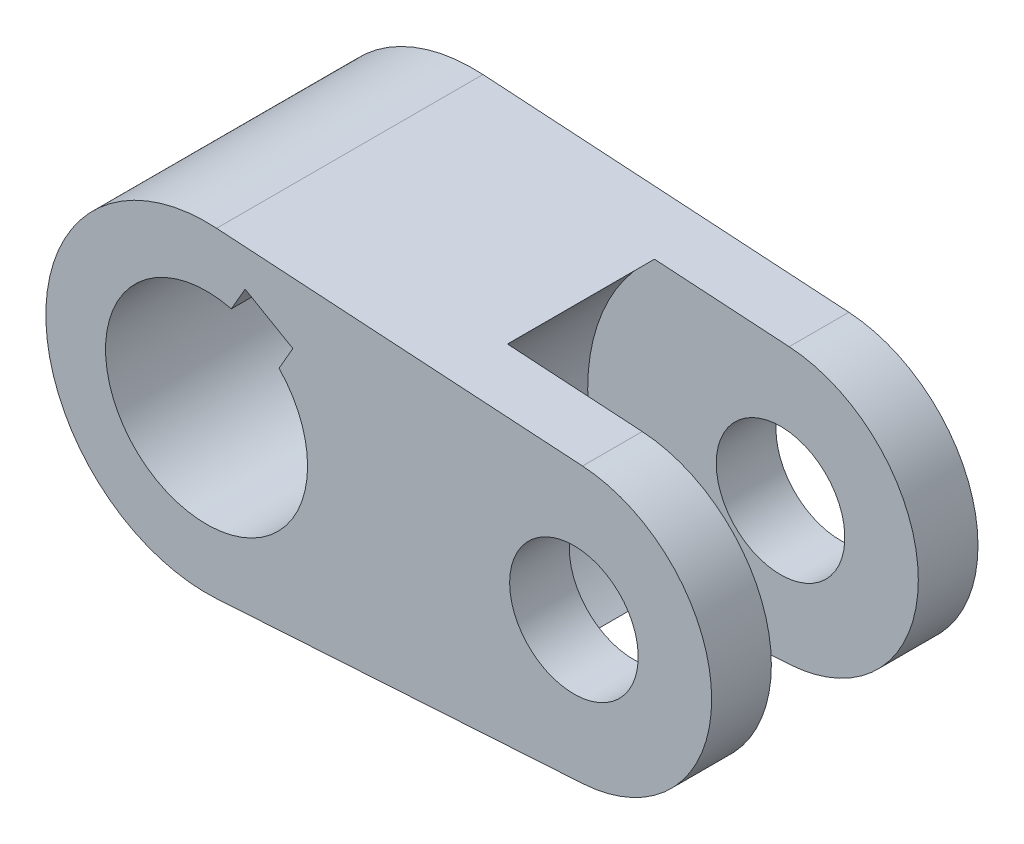
ISO-10303-21;
HEADER;
FILE_DESCRIPTION(('STEP AP214'),'2;1');
FILE_NAME('part.step','',(''),(''),'','','');
FILE_SCHEMA(('AUTOMOTIVE_DESIGN { 1 0 10303 214 1 1 1 1 }'));
ENDSEC;
DATA;
#1=APPLICATION_CONTEXT('core data for automotive mechanical design processes');
#2=APPLICATION_PROTOCOL_DEFINITION('international standard','automotive_design',2000,#1);
#3=PRODUCT_CONTEXT('',#1,'mechanical');
#4=PRODUCT('Part','Part','',(#3));
#5=PRODUCT_RELATED_PRODUCT_CATEGORY('part','',(#4));
#6=PRODUCT_DEFINITION_FORMATION('','',#4);
#7=PRODUCT_DEFINITION_CONTEXT('part definition',#1,'design');
#8=PRODUCT_DEFINITION('design','',#6,#7);
#9=PRODUCT_DEFINITION_SHAPE('','',#8);
#10=(LENGTH_UNIT() NAMED_UNIT(*) SI_UNIT(.MILLI.,.METRE.));
#11=(NAMED_UNIT(*) PLANE_ANGLE_UNIT() SI_UNIT($,.RADIAN.));
#12=(NAMED_UNIT(*) SI_UNIT($,.STERADIAN.) SOLID_ANGLE_UNIT());
#13=UNCERTAINTY_MEASURE_WITH_UNIT(LENGTH_MEASURE(1.E-05),#10,'distance_accuracy_value','');
#14=(GEOMETRIC_REPRESENTATION_CONTEXT(3) GLOBAL_UNCERTAINTY_ASSIGNED_CONTEXT((#13)) GLOBAL_UNIT_ASSIGNED_CONTEXT((#10,
#11,#12)) REPRESENTATION_CONTEXT('',''));
#15=CARTESIAN_POINT('',(0.,0.,0.));
#16=DIRECTION('',(0.,0.,1.));
#17=DIRECTION('',(1.,0.,0.));
#18=AXIS2_PLACEMENT_3D('',#15,#16,#17);
#19=CARTESIAN_POINT('',(40.,0.,14.5));
#20=DIRECTION('',(0.,0.,-1.));
#21=DIRECTION('',(-1.,0.,0.));
#22=AXIS2_PLACEMENT_3D('',#19,#20,#21);
#23=CYLINDRICAL_SURFACE('',#22,15.);
#24=CARTESIAN_POINT('',(40.,0.,-8.));
#25=DIRECTION('',(0.,0.,1.));
#26=DIRECTION('',(1.,0.,0.));
#27=AXIS2_PLACEMENT_3D('',#24,#25,#26);
#28=CIRCLE('',#27,15.);
#29=CARTESIAN_POINT('',(40.9375,-14.9706744587544,-8.));
#30=VERTEX_POINT('',#29);
#31=CARTESIAN_POINT('',(40.9375,14.9706744587544,-8.));
#32=VERTEX_POINT('',#31);
#33=EDGE_CURVE('E154',#30,#32,#28,.T.);
#34=ORIENTED_EDGE('',*,*,#33,.F.);
#35=DIRECTION('',(0.,0.,-1.));
#36=VECTOR('',#35,1.);
#37=CARTESIAN_POINT('',(40.9375,-14.9706744587544,14.5));
#38=LINE('',#37,#36);
#39=CARTESIAN_POINT('',(40.9375,-14.9706744587544,-14.5));
#40=VERTEX_POINT('',#39);
#41=EDGE_CURVE('E202',#30,#40,#38,.T.);
#42=ORIENTED_EDGE('',*,*,#41,.T.);
#43=CARTESIAN_POINT('',(40.,0.,-14.5));
#44=DIRECTION('',(0.,0.,1.));
#45=DIRECTION('',(1.,0.,0.));
#46=AXIS2_PLACEMENT_3D('',#43,#44,#45);
#47=CIRCLE('',#46,15.);
#48=CARTESIAN_POINT('',(40.9375,14.9706744587544,-14.5));
#49=VERTEX_POINT('',#48);
#50=EDGE_CURVE('E191',#40,#49,#47,.T.);
#51=ORIENTED_EDGE('',*,*,#50,.T.);
#52=DIRECTION('',(0.,0.,-1.));
#53=VECTOR('',#52,1.);
#54=CARTESIAN_POINT('',(40.9375,14.9706744587544,14.5));
#55=LINE('',#54,#53);
#56=EDGE_CURVE('E220',#32,#49,#55,.T.);
#57=ORIENTED_EDGE('',*,*,#56,.F.);
#58=EDGE_LOOP('',(#34,#42,#51,#57));
#59=FACE_BOUND('',#58,.T.);
#60=ADVANCED_FACE('F37',(#59),#23,.T.);
#61=CARTESIAN_POINT('',(40.9375,14.9706744587544,14.5));
#62=DIRECTION('',(-0.0625,-0.998044963916957,0.));
#63=DIRECTION('',(0.998044963916957,-0.0625,0.));
#64=AXIS2_PLACEMENT_3D('',#61,#62,#63);
#65=PLANE('',#64);
#66=DIRECTION('',(-0.998044963916957,0.0625,0.));
#67=VECTOR('',#66,1.);
#68=CARTESIAN_POINT('',(40.9375,14.9706744587544,-8.));
#69=LINE('',#68,#67);
#70=CARTESIAN_POINT('',(26.269294588294,15.889233112298,-8.));
#71=VERTEX_POINT('',#70);
#72=EDGE_CURVE('E137',#32,#71,#69,.T.);
#73=ORIENTED_EDGE('',*,*,#72,.F.);
#74=ORIENTED_EDGE('',*,*,#56,.T.);
#75=DIRECTION('',(-0.998044963916957,0.0625,0.));
#76=VECTOR('',#75,1.);
#77=CARTESIAN_POINT('',(40.9375,14.9706744587544,-14.5));
#78=LINE('',#77,#76);
#79=CARTESIAN_POINT('',(1.09375,17.4657868685467,-14.5));
#80=VERTEX_POINT('',#79);
#81=EDGE_CURVE('E205',#49,#80,#78,.T.);
#82=ORIENTED_EDGE('',*,*,#81,.T.);
#83=DIRECTION('',(0.,0.,-1.));
#84=VECTOR('',#83,1.);
#85=CARTESIAN_POINT('',(1.09375,17.4657868685467,14.5));
#86=LINE('',#85,#84);
#87=CARTESIAN_POINT('',(1.09375,17.4657868685467,14.5));
#88=VERTEX_POINT('',#87);
#89=EDGE_CURVE('E217',#88,#80,#86,.T.);
#90=ORIENTED_EDGE('',*,*,#89,.F.);
#91=DIRECTION('',(-0.998044963916957,0.0625,0.));
#92=VECTOR('',#91,1.);
#93=CARTESIAN_POINT('',(40.9375,14.9706744587544,14.5));
#94=LINE('',#93,#92);
#95=CARTESIAN_POINT('',(40.9375,14.9706744587544,14.5));
#96=VERTEX_POINT('',#95);
#97=EDGE_CURVE('E195',#96,#88,#94,.T.);
#98=ORIENTED_EDGE('',*,*,#97,.F.);
#99=CARTESIAN_POINT('',(40.9375,14.9706744587544,8.));
#100=VERTEX_POINT('',#99);
#101=EDGE_CURVE('E45',#96,#100,#55,.T.);
#102=ORIENTED_EDGE('',*,*,#101,.T.);
#103=DIRECTION('',(-0.998044963916957,0.0625,0.));
#104=VECTOR('',#103,1.);
#105=CARTESIAN_POINT('',(40.9375,14.9706744587544,8.));
#106=LINE('',#105,#104);
#107=CARTESIAN_POINT('',(26.269294588294,15.889233112298,8.));
#108=VERTEX_POINT('',#107);
#109=EDGE_CURVE('E140',#100,#108,#106,.T.);
#110=ORIENTED_EDGE('',*,*,#109,.T.);
#111=DIRECTION('',(0.,0.,1.));
#112=VECTOR('',#111,1.);
#113=CARTESIAN_POINT('',(26.2692945882941,15.889233112298,-8.));
#114=LINE('',#113,#112);
#115=EDGE_CURVE('E127',#108,#71,#114,.F.);
#116=ORIENTED_EDGE('',*,*,#115,.T.);
#117=EDGE_LOOP('',(#73,#74,#82,#90,#98,#102,#110,#116));
#118=FACE_BOUND('',#117,.T.);
#119=ADVANCED_FACE('F144',(#118),#65,.F.);
#120=CARTESIAN_POINT('',(40.9375,-14.9706744587544,14.5));
#121=DIRECTION('',(-0.0625000000000001,0.998044963916957,0.));
#122=DIRECTION('',(-0.998044963916957,-0.0625000000000001,0.));
#123=AXIS2_PLACEMENT_3D('',#120,#121,#122);
#124=PLANE('',#123);
#125=DIRECTION('',(0.998044963916957,0.0625000000000001,0.));
#126=VECTOR('',#125,1.);
#127=CARTESIAN_POINT('',(40.9375,-14.9706744587544,-8.));
#128=LINE('',#127,#126);
#129=CARTESIAN_POINT('',(26.2692945882941,-15.8892331122981,-8.));
#130=VERTEX_POINT('',#129);
#131=EDGE_CURVE('E149',#130,#30,#128,.T.);
#132=ORIENTED_EDGE('',*,*,#131,.F.);
#133=DIRECTION('',(0.,0.,1.));
#134=VECTOR('',#133,1.);
#135=CARTESIAN_POINT('',(26.2692945882941,-15.889233112298,-8.));
#136=LINE('',#135,#134);
#137=CARTESIAN_POINT('',(26.2692945882941,-15.8892331122981,8.));
#138=VERTEX_POINT('',#137);
#139=EDGE_CURVE('E11',#130,#138,#136,.T.);
#140=ORIENTED_EDGE('',*,*,#139,.T.);
#141=DIRECTION('',(0.998044963916957,0.0625000000000001,0.));
#142=VECTOR('',#141,1.);
#143=CARTESIAN_POINT('',(40.9375,-14.9706744587544,8.));
#144=LINE('',#143,#142);
#145=CARTESIAN_POINT('',(40.9375,-14.9706744587544,8.));
#146=VERTEX_POINT('',#145);
#147=EDGE_CURVE('E141',#138,#146,#144,.T.);
#148=ORIENTED_EDGE('',*,*,#147,.T.);
#149=CARTESIAN_POINT('',(40.9375,-14.9706744587544,14.5));
#150=VERTEX_POINT('',#149);
#151=EDGE_CURVE('E211',#150,#146,#38,.T.);
#152=ORIENTED_EDGE('',*,*,#151,.F.);
#153=DIRECTION('',(0.998044963916957,0.0625000000000001,0.));
#154=VECTOR('',#153,1.);
#155=CARTESIAN_POINT('',(40.9375,-14.9706744587544,14.5));
#156=LINE('',#155,#154);
#157=CARTESIAN_POINT('',(1.09374999999999,-17.4657868685468,14.5));
#158=VERTEX_POINT('',#157);
#159=EDGE_CURVE('E200',#158,#150,#156,.T.);
#160=ORIENTED_EDGE('',*,*,#159,.F.);
#161=DIRECTION('',(0.,0.,-1.));
#162=VECTOR('',#161,1.);
#163=CARTESIAN_POINT('',(1.09374999999999,-17.4657868685468,14.5));
#164=LINE('',#163,#162);
#165=CARTESIAN_POINT('',(1.09374999999999,-17.4657868685468,-14.5));
#166=VERTEX_POINT('',#165);
#167=EDGE_CURVE('E214',#158,#166,#164,.T.);
#168=ORIENTED_EDGE('',*,*,#167,.T.);
#169=DIRECTION('',(0.998044963916957,0.0625000000000001,0.));
#170=VECTOR('',#169,1.);
#171=CARTESIAN_POINT('',(40.9375,-14.9706744587544,-14.5));
#172=LINE('',#171,#170);
#173=EDGE_CURVE('E196',#166,#40,#172,.T.);
#174=ORIENTED_EDGE('',*,*,#173,.T.);
#175=ORIENTED_EDGE('',*,*,#41,.F.);
#176=EDGE_LOOP('',(#132,#140,#148,#152,#160,#168,#174,#175));
#177=FACE_BOUND('',#176,.T.);
#178=ADVANCED_FACE('F233',(#177),#124,.F.);
#179=CARTESIAN_POINT('',(40.,0.,14.5));
#180=DIRECTION('',(0.,0.,-1.));
#181=DIRECTION('',(-1.,0.,0.));
#182=AXIS2_PLACEMENT_3D('',#179,#180,#181);
#183=CYLINDRICAL_SURFACE('',#182,7.);
#184=CARTESIAN_POINT('',(40.,0.,-14.5));
#185=DIRECTION('',(0.,0.,1.));
#186=DIRECTION('',(1.,0.,0.));
#187=AXIS2_PLACEMENT_3D('',#184,#185,#186);
#188=CIRCLE('',#187,7.);
#189=CARTESIAN_POINT('',(33.,0.,-14.5));
#190=VERTEX_POINT('',#189);
#191=EDGE_CURVE('E136',#190,#190,#188,.T.);
#192=CARTESIAN_POINT('',(40.,0.,-8.));
#193=DIRECTION('',(0.,0.,1.));
#194=DIRECTION('',(1.,0.,0.));
#195=AXIS2_PLACEMENT_3D('',#192,#193,#194);
#196=CIRCLE('',#195,7.);
#197=CARTESIAN_POINT('',(33.,0.,-8.));
#198=VERTEX_POINT('',#197);
#199=EDGE_CURVE('E146',#198,#198,#196,.T.);
#200=CARTESIAN_POINT('',(33.,0.,-14.5));
#201=CARTESIAN_POINT('',(33.,0.,-14.4322916666667));
#202=CARTESIAN_POINT('',(33.,0.,-14.3645833333333));
#203=CARTESIAN_POINT('',(33.,0.,-14.2291666666667));
#204=CARTESIAN_POINT('',(33.,0.,-14.1614583333333));
#205=CARTESIAN_POINT('',(33.,0.,-14.0260416666667));
#206=CARTESIAN_POINT('',(33.,0.,-13.9583333333333));
#207=CARTESIAN_POINT('',(33.,0.,-13.8229166666667));
#208=CARTESIAN_POINT('',(33.,0.,-13.7552083333333));
#209=CARTESIAN_POINT('',(33.,0.,-13.6197916666667));
#210=CARTESIAN_POINT('',(33.,0.,-13.5520833333333));
#211=CARTESIAN_POINT('',(33.,0.,-13.4166666666667));
#212=CARTESIAN_POINT('',(33.,0.,-13.3489583333333));
#213=CARTESIAN_POINT('',(33.,0.,-13.2135416666667));
#214=CARTESIAN_POINT('',(33.,0.,-13.1458333333333));
#215=CARTESIAN_POINT('',(33.,0.,-13.0104166666667));
#216=CARTESIAN_POINT('',(33.,0.,-12.9427083333333));
#217=CARTESIAN_POINT('',(33.,0.,-12.8072916666667));
#218=CARTESIAN_POINT('',(33.,0.,-12.7395833333333));
#219=CARTESIAN_POINT('',(33.,0.,-12.6041666666667));
#220=CARTESIAN_POINT('',(33.,0.,-12.5364583333333));
#221=CARTESIAN_POINT('',(33.,0.,-12.4010416666667));
#222=CARTESIAN_POINT('',(33.,0.,-12.3333333333333));
#223=CARTESIAN_POINT('',(33.,0.,-12.1979166666667));
#224=CARTESIAN_POINT('',(33.,0.,-12.1302083333333));
#225=CARTESIAN_POINT('',(33.,0.,-11.9947916666667));
#226=CARTESIAN_POINT('',(33.,0.,-11.9270833333333));
#227=CARTESIAN_POINT('',(33.,0.,-11.7916666666667));
#228=CARTESIAN_POINT('',(33.,0.,-11.7239583333333));
#229=CARTESIAN_POINT('',(33.,0.,-11.5885416666667));
#230=CARTESIAN_POINT('',(33.,0.,-11.5208333333333));
#231=CARTESIAN_POINT('',(33.,0.,-11.3854166666667));
#232=CARTESIAN_POINT('',(33.,0.,-11.3177083333333));
#233=CARTESIAN_POINT('',(33.,0.,-11.1822916666667));
#234=CARTESIAN_POINT('',(33.,0.,-11.1145833333333));
#235=CARTESIAN_POINT('',(33.,0.,-10.9791666666667));
#236=CARTESIAN_POINT('',(33.,0.,-10.9114583333333));
#237=CARTESIAN_POINT('',(33.,0.,-10.7760416666667));
#238=CARTESIAN_POINT('',(33.,0.,-10.7083333333333));
#239=CARTESIAN_POINT('',(33.,0.,-10.5729166666667));
#240=CARTESIAN_POINT('',(33.,0.,-10.5052083333333));
#241=CARTESIAN_POINT('',(33.,0.,-10.3697916666667));
#242=CARTESIAN_POINT('',(33.,0.,-10.3020833333333));
#243=CARTESIAN_POINT('',(33.,0.,-10.1666666666667));
#244=CARTESIAN_POINT('',(33.,0.,-10.0989583333333));
#245=CARTESIAN_POINT('',(33.,0.,-9.96354166666667));
#246=CARTESIAN_POINT('',(33.,0.,-9.89583333333333));
#247=CARTESIAN_POINT('',(33.,0.,-9.76041666666667));
#248=CARTESIAN_POINT('',(33.,0.,-9.69270833333334));
#249=CARTESIAN_POINT('',(33.,0.,-9.55729166666667));
#250=CARTESIAN_POINT('',(33.,0.,-9.48958333333334));
#251=CARTESIAN_POINT('',(33.,0.,-9.35416666666667));
#252=CARTESIAN_POINT('',(33.,0.,-9.28645833333333));
#253=CARTESIAN_POINT('',(33.,0.,-9.15104166666667));
#254=CARTESIAN_POINT('',(33.,0.,-9.08333333333333));
#255=CARTESIAN_POINT('',(33.,0.,-8.94791666666667));
#256=CARTESIAN_POINT('',(33.,0.,-8.88020833333334));
#257=CARTESIAN_POINT('',(33.,0.,-8.74479166666667));
#258=CARTESIAN_POINT('',(33.,0.,-8.67708333333334));
#259=CARTESIAN_POINT('',(33.,0.,-8.54166666666667));
#260=CARTESIAN_POINT('',(33.,0.,-8.47395833333334));
#261=CARTESIAN_POINT('',(33.,0.,-8.33854166666667));
#262=CARTESIAN_POINT('',(33.,0.,-8.27083333333334));
#263=CARTESIAN_POINT('',(33.,0.,-8.13541666666667));
#264=CARTESIAN_POINT('',(33.,0.,-8.06770833333333));
#265=CARTESIAN_POINT('',(33.,0.,-8.));
#266=B_SPLINE_CURVE_WITH_KNOTS('',3,(#200,#201,#202,#203,#204,#205,#206,#207,#208,#209,#210,
#211,#212,#213,#214,#215,#216,#217,#218,#219,#220,#221,#222,#223,#224,#225,#226,#227,#228,#229,
#230,#231,#232,#233,#234,#235,#236,#237,#238,#239,#240,#241,#242,#243,#244,#245,#246,#247,#248,
#249,#250,#251,#252,#253,#254,#255,#256,#257,#258,#259,#260,#261,#262,#263,#264,#265),
.UNSPECIFIED.,.F.,.F.,(4,2,2,2,2,2,2,2,2,2,2,2,2,2,2,2,2,2,2,2,2,2,2,2,2,2,2,2,2,2,2,2,4),(0.,
0.203124999999998,0.40625,0.609374999999999,0.812500000000001,1.015625,1.21875,1.421875,1.625,
1.828125,2.03125,2.234375,2.4375,2.640625,2.84375,3.046875,3.25,3.453125,3.65625,3.859375,
4.0625,4.265625,4.46875,4.671875,4.875,5.078125,5.28125,5.484375,5.6875,5.890625,6.09375,
6.296875,6.5),.UNSPECIFIED.);
#267=EDGE_CURVE('BSEAM270',#190,#198,#266,.T.);
#268=ORIENTED_EDGE('',*,*,#191,.F.);
#269=ORIENTED_EDGE('',*,*,#199,.T.);
#270=ORIENTED_EDGE('',*,*,#267,.T.);
#271=ORIENTED_EDGE('',*,*,#267,.F.);
#272=EDGE_LOOP('',(#268,#270,#269,#271));
#273=FACE_BOUND('',#272,.T.);
#274=ADVANCED_FACE('F270',(#273),#183,.F.);
#275=CARTESIAN_POINT('',(40.,0.,14.5));
#276=DIRECTION('',(0.,0.,1.));
#277=DIRECTION('',(1.,0.,0.));
#278=AXIS2_PLACEMENT_3D('',#275,#276,#277);
#279=PLANE('',#278);
#280=DIRECTION('',(-0.499999999999998,-0.86602540378444,0.));
#281=VECTOR('',#280,1.);
#282=CARTESIAN_POINT('',(2.69342641077584,10.6651513899117,14.5));
#283=LINE('',#282,#281);
#284=CARTESIAN_POINT('',(4.20192378864665,13.2779454914684,14.5));
#285=VERTEX_POINT('',#284);
#286=CARTESIAN_POINT('',(2.69342641077584,10.6651513899117,14.5));
#287=VERTEX_POINT('',#286);
#288=EDGE_CURVE('E165',#285,#287,#283,.T.);
#289=ORIENTED_EDGE('',*,*,#288,.F.);
#290=DIRECTION('',(-0.86602540378444,0.499999999999997,0.));
#291=VECTOR('',#290,1.);
#292=CARTESIAN_POINT('',(4.20192378864665,13.2779454914684,14.5));
#293=LINE('',#292,#291);
#294=CARTESIAN_POINT('',(9.39807621135329,10.2779454914684,14.5));
#295=VERTEX_POINT('',#294);
#296=EDGE_CURVE('E163',#295,#285,#293,.T.);
#297=ORIENTED_EDGE('',*,*,#296,.F.);
#298=DIRECTION('',(0.499999999999997,0.86602540378444,0.));
#299=VECTOR('',#298,1.);
#300=CARTESIAN_POINT('',(9.39807621135329,10.2779454914684,14.5));
#301=LINE('',#300,#299);
#302=CARTESIAN_POINT('',(7.88957883348247,7.66515138991171,14.5));
#303=VERTEX_POINT('',#302);
#304=EDGE_CURVE('E170',#303,#295,#301,.T.);
#305=ORIENTED_EDGE('',*,*,#304,.F.);
#306=CARTESIAN_POINT('',(0.,0.,14.5));
#307=DIRECTION('',(0.,0.,1.));
#308=DIRECTION('',(1.,0.,0.));
#309=AXIS2_PLACEMENT_3D('',#306,#307,#308);
#310=CIRCLE('',#309,11.);
#311=EDGE_CURVE('E168',#287,#303,#310,.T.);
#312=ORIENTED_EDGE('',*,*,#311,.F.);
#313=EDGE_LOOP('',(#289,#297,#305,#312));
#314=FACE_BOUND('',#313,.T.);
#315=CARTESIAN_POINT('',(40.,0.,14.5));
#316=DIRECTION('',(0.,0.,1.));
#317=DIRECTION('',(1.,0.,0.));
#318=AXIS2_PLACEMENT_3D('',#315,#316,#317);
#319=CIRCLE('',#318,15.);
#320=EDGE_CURVE('E192',#150,#96,#319,.T.);
#321=ORIENTED_EDGE('',*,*,#320,.T.);
#322=ORIENTED_EDGE('',*,*,#97,.T.);
#323=CARTESIAN_POINT('',(0.,0.,14.5));
#324=DIRECTION('',(0.,0.,1.));
#325=DIRECTION('',(1.,0.,0.));
#326=AXIS2_PLACEMENT_3D('',#323,#324,#325);
#327=CIRCLE('',#326,17.5);
#328=EDGE_CURVE('E198',#88,#158,#327,.T.);
#329=ORIENTED_EDGE('',*,*,#328,.T.);
#330=ORIENTED_EDGE('',*,*,#159,.T.);
#331=EDGE_LOOP('',(#321,#322,#329,#330));
#332=FACE_BOUND('',#331,.T.);
#333=CARTESIAN_POINT('',(40.,0.,14.5));
#334=DIRECTION('',(0.,0.,1.));
#335=DIRECTION('',(1.,0.,0.));
#336=AXIS2_PLACEMENT_3D('',#333,#334,#335);
#337=CIRCLE('',#336,7.);
#338=CARTESIAN_POINT('',(33.,0.,14.5));
#339=VERTEX_POINT('',#338);
#340=EDGE_CURVE('E157',#339,#339,#337,.T.);
#341=ORIENTED_EDGE('',*,*,#340,.F.);
#342=EDGE_LOOP('',(#341));
#343=FACE_BOUND('',#342,.T.);
#344=ADVANCED_FACE('F252',(#314,#332,#343),#279,.T.);
#345=CARTESIAN_POINT('',(40.,0.,-14.5));
#346=DIRECTION('',(0.,0.,1.));
#347=DIRECTION('',(1.,0.,0.));
#348=AXIS2_PLACEMENT_3D('',#345,#346,#347);
#349=PLANE('',#348);
#350=ORIENTED_EDGE('',*,*,#50,.F.);
#351=ORIENTED_EDGE('',*,*,#173,.F.);
#352=CARTESIAN_POINT('',(0.,0.,-14.5));
#353=DIRECTION('',(0.,0.,1.));
#354=DIRECTION('',(1.,0.,0.));
#355=AXIS2_PLACEMENT_3D('',#352,#353,#354);
#356=CIRCLE('',#355,17.5);
#357=EDGE_CURVE('E207',#80,#166,#356,.T.);
#358=ORIENTED_EDGE('',*,*,#357,.F.);
#359=ORIENTED_EDGE('',*,*,#81,.F.);
#360=EDGE_LOOP('',(#350,#351,#358,#359));
#361=FACE_BOUND('',#360,.T.);
#362=DIRECTION('',(-0.86602540378444,0.499999999999997,0.));
#363=VECTOR('',#362,1.);
#364=CARTESIAN_POINT('',(4.20192378864665,13.2779454914684,-14.5));
#365=LINE('',#364,#363);
#366=CARTESIAN_POINT('',(9.39807621135328,10.2779454914684,-14.5));
#367=VERTEX_POINT('',#366);
#368=CARTESIAN_POINT('',(4.20192378864665,13.2779454914684,-14.5));
#369=VERTEX_POINT('',#368);
#370=EDGE_CURVE('E160',#367,#369,#365,.T.);
#371=ORIENTED_EDGE('',*,*,#370,.T.);
#372=DIRECTION('',(-0.499999999999998,-0.86602540378444,0.));
#373=VECTOR('',#372,1.);
#374=CARTESIAN_POINT('',(2.69342641077584,10.6651513899117,-14.5));
#375=LINE('',#374,#373);
#376=CARTESIAN_POINT('',(2.69342641077584,10.6651513899117,-14.5));
#377=VERTEX_POINT('',#376);
#378=EDGE_CURVE('E175',#369,#377,#375,.T.);
#379=ORIENTED_EDGE('',*,*,#378,.T.);
#380=CARTESIAN_POINT('',(0.,0.,-14.5));
#381=DIRECTION('',(0.,0.,1.));
#382=DIRECTION('',(1.,0.,0.));
#383=AXIS2_PLACEMENT_3D('',#380,#381,#382);
#384=CIRCLE('',#383,11.);
#385=CARTESIAN_POINT('',(7.88957883348248,7.6651513899117,-14.5));
#386=VERTEX_POINT('',#385);
#387=EDGE_CURVE('E178',#377,#386,#384,.T.);
#388=ORIENTED_EDGE('',*,*,#387,.T.);
#389=DIRECTION('',(0.499999999999997,0.86602540378444,0.));
#390=VECTOR('',#389,1.);
#391=CARTESIAN_POINT('',(9.39807621135329,10.2779454914684,-14.5));
#392=LINE('',#391,#390);
#393=EDGE_CURVE('E166',#386,#367,#392,.T.);
#394=ORIENTED_EDGE('',*,*,#393,.T.);
#395=EDGE_LOOP('',(#371,#379,#388,#394));
#396=FACE_BOUND('',#395,.T.);
#397=ORIENTED_EDGE('',*,*,#191,.T.);
#398=EDGE_LOOP('',(#397));
#399=FACE_BOUND('',#398,.T.);
#400=ADVANCED_FACE('F242',(#361,#396,#399),#349,.F.);
#401=ORIENTED_EDGE('',*,*,#151,.T.);
#402=CARTESIAN_POINT('',(40.,0.,8.));
#403=DIRECTION('',(0.,0.,1.));
#404=DIRECTION('',(1.,0.,0.));
#405=AXIS2_PLACEMENT_3D('',#402,#403,#404);
#406=CIRCLE('',#405,15.);
#407=EDGE_CURVE('E52',#146,#100,#406,.T.);
#408=ORIENTED_EDGE('',*,*,#407,.T.);
#409=ORIENTED_EDGE('',*,*,#101,.F.);
#410=ORIENTED_EDGE('',*,*,#320,.F.);
#411=EDGE_LOOP('',(#401,#408,#409,#410));
#412=FACE_BOUND('',#411,.T.);
#413=ADVANCED_FACE('F39',(#412),#23,.T.);
#414=CARTESIAN_POINT('',(0.,0.,14.5));
#415=DIRECTION('',(0.,0.,-1.));
#416=DIRECTION('',(-1.,0.,0.));
#417=AXIS2_PLACEMENT_3D('',#414,#415,#416);
#418=CYLINDRICAL_SURFACE('',#417,17.5);
#419=ORIENTED_EDGE('',*,*,#357,.T.);
#420=ORIENTED_EDGE('',*,*,#167,.F.);
#421=ORIENTED_EDGE('',*,*,#328,.F.);
#422=ORIENTED_EDGE('',*,*,#89,.T.);
#423=EDGE_LOOP('',(#419,#420,#421,#422));
#424=FACE_BOUND('',#423,.T.);
#425=ADVANCED_FACE('F246',(#424),#418,.T.);
#426=CARTESIAN_POINT('',(4.20192378864665,13.2779454914684,14.5));
#427=DIRECTION('',(-0.499999999999997,-0.86602540378444,0.));
#428=DIRECTION('',(0.86602540378444,-0.499999999999997,0.));
#429=AXIS2_PLACEMENT_3D('',#426,#427,#428);
#430=PLANE('',#429);
#431=ORIENTED_EDGE('',*,*,#370,.F.);
#432=DIRECTION('',(0.,0.,-1.));
#433=VECTOR('',#432,1.);
#434=CARTESIAN_POINT('',(9.39807621135329,10.2779454914684,14.5));
#435=LINE('',#434,#433);
#436=EDGE_CURVE('E172',#295,#367,#435,.T.);
#437=ORIENTED_EDGE('',*,*,#436,.F.);
#438=ORIENTED_EDGE('',*,*,#296,.T.);
#439=DIRECTION('',(0.,0.,-1.));
#440=VECTOR('',#439,1.);
#441=CARTESIAN_POINT('',(4.20192378864665,13.2779454914684,14.5));
#442=LINE('',#441,#440);
#443=EDGE_CURVE('E188',#285,#369,#442,.T.);
#444=ORIENTED_EDGE('',*,*,#443,.T.);
#445=EDGE_LOOP('',(#431,#437,#438,#444));
#446=FACE_BOUND('',#445,.T.);
#447=ADVANCED_FACE('F260',(#446),#430,.T.);
#448=CARTESIAN_POINT('',(2.69342641077584,10.6651513899117,14.5));
#449=DIRECTION('',(0.86602540378444,-0.499999999999998,0.));
#450=DIRECTION('',(0.499999999999998,0.86602540378444,0.));
#451=AXIS2_PLACEMENT_3D('',#448,#449,#450);
#452=PLANE('',#451);
#453=ORIENTED_EDGE('',*,*,#378,.F.);
#454=ORIENTED_EDGE('',*,*,#443,.F.);
#455=ORIENTED_EDGE('',*,*,#288,.T.);
#456=DIRECTION('',(0.,0.,-1.));
#457=VECTOR('',#456,1.);
#458=CARTESIAN_POINT('',(2.69342641077584,10.6651513899117,14.5));
#459=LINE('',#458,#457);
#460=EDGE_CURVE('E186',#287,#377,#459,.T.);
#461=ORIENTED_EDGE('',*,*,#460,.T.);
#462=EDGE_LOOP('',(#453,#454,#455,#461));
#463=FACE_BOUND('',#462,.T.);
#464=ADVANCED_FACE('F278',(#463),#452,.T.);
#465=CARTESIAN_POINT('',(0.,0.,14.5));
#466=DIRECTION('',(0.,0.,-1.));
#467=DIRECTION('',(-1.,0.,0.));
#468=AXIS2_PLACEMENT_3D('',#465,#466,#467);
#469=CYLINDRICAL_SURFACE('',#468,11.);
#470=ORIENTED_EDGE('',*,*,#387,.F.);
#471=ORIENTED_EDGE('',*,*,#460,.F.);
#472=ORIENTED_EDGE('',*,*,#311,.T.);
#473=DIRECTION('',(0.,0.,-1.));
#474=VECTOR('',#473,1.);
#475=CARTESIAN_POINT('',(7.88957883348248,7.6651513899117,14.5));
#476=LINE('',#475,#474);
#477=EDGE_CURVE('E60',#303,#386,#476,.T.);
#478=ORIENTED_EDGE('',*,*,#477,.T.);
#479=EDGE_LOOP('',(#470,#471,#472,#478));
#480=FACE_BOUND('',#479,.T.);
#481=ADVANCED_FACE('F282',(#480),#469,.F.);
#482=CARTESIAN_POINT('',(9.39807621135329,10.2779454914684,14.5));
#483=DIRECTION('',(-0.86602540378444,0.499999999999997,0.));
#484=DIRECTION('',(-0.499999999999997,-0.86602540378444,0.));
#485=AXIS2_PLACEMENT_3D('',#482,#483,#484);
#486=PLANE('',#485);
#487=ORIENTED_EDGE('',*,*,#393,.F.);
#488=ORIENTED_EDGE('',*,*,#477,.F.);
#489=ORIENTED_EDGE('',*,*,#304,.T.);
#490=ORIENTED_EDGE('',*,*,#436,.T.);
#491=EDGE_LOOP('',(#487,#488,#489,#490));
#492=FACE_BOUND('',#491,.T.);
#493=ADVANCED_FACE('F286',(#492),#486,.T.);
#494=CARTESIAN_POINT('',(40.,0.,8.));
#495=DIRECTION('',(0.,0.,1.));
#496=DIRECTION('',(1.,0.,0.));
#497=AXIS2_PLACEMENT_3D('',#494,#495,#496);
#498=CIRCLE('',#497,7.);
#499=CARTESIAN_POINT('',(33.,0.,8.));
#500=VERTEX_POINT('',#499);
#501=EDGE_CURVE('E222',#500,#500,#498,.T.);
#502=CARTESIAN_POINT('',(33.,0.,8.));
#503=CARTESIAN_POINT('',(33.,0.,8.06770833333333));
#504=CARTESIAN_POINT('',(33.,0.,8.13541666666667));
#505=CARTESIAN_POINT('',(33.,0.,8.27083333333333));
#506=CARTESIAN_POINT('',(33.,0.,8.33854166666667));
#507=CARTESIAN_POINT('',(33.,0.,8.47395833333333));
#508=CARTESIAN_POINT('',(33.,0.,8.54166666666667));
#509=CARTESIAN_POINT('',(33.,0.,8.67708333333333));
#510=CARTESIAN_POINT('',(33.,0.,8.74479166666667));
#511=CARTESIAN_POINT('',(33.,0.,8.88020833333333));
#512=CARTESIAN_POINT('',(33.,0.,8.94791666666667));
#513=CARTESIAN_POINT('',(33.,0.,9.08333333333333));
#514=CARTESIAN_POINT('',(33.,0.,9.15104166666667));
#515=CARTESIAN_POINT('',(33.,0.,9.28645833333333));
#516=CARTESIAN_POINT('',(33.,0.,9.35416666666667));
#517=CARTESIAN_POINT('',(33.,0.,9.48958333333333));
#518=CARTESIAN_POINT('',(33.,0.,9.55729166666667));
#519=CARTESIAN_POINT('',(33.,0.,9.69270833333333));
#520=CARTESIAN_POINT('',(33.,0.,9.76041666666667));
#521=CARTESIAN_POINT('',(33.,0.,9.89583333333333));
#522=CARTESIAN_POINT('',(33.,0.,9.96354166666667));
#523=CARTESIAN_POINT('',(33.,0.,10.0989583333333));
#524=CARTESIAN_POINT('',(33.,0.,10.1666666666667));
#525=CARTESIAN_POINT('',(33.,0.,10.3020833333333));
#526=CARTESIAN_POINT('',(33.,0.,10.3697916666667));
#527=CARTESIAN_POINT('',(33.,0.,10.5052083333333));
#528=CARTESIAN_POINT('',(33.,0.,10.5729166666667));
#529=CARTESIAN_POINT('',(33.,0.,10.7083333333333));
#530=CARTESIAN_POINT('',(33.,0.,10.7760416666667));
#531=CARTESIAN_POINT('',(33.,0.,10.9114583333333));
#532=CARTESIAN_POINT('',(33.,0.,10.9791666666667));
#533=CARTESIAN_POINT('',(33.,0.,11.1145833333333));
#534=CARTESIAN_POINT('',(33.,0.,11.1822916666667));
#535=CARTESIAN_POINT('',(33.,0.,11.3177083333333));
#536=CARTESIAN_POINT('',(33.,0.,11.3854166666667));
#537=CARTESIAN_POINT('',(33.,0.,11.5208333333333));
#538=CARTESIAN_POINT('',(33.,0.,11.5885416666667));
#539=CARTESIAN_POINT('',(33.,0.,11.7239583333333));
#540=CARTESIAN_POINT('',(33.,0.,11.7916666666667));
#541=CARTESIAN_POINT('',(33.,0.,11.9270833333333));
#542=CARTESIAN_POINT('',(33.,0.,11.9947916666667));
#543=CARTESIAN_POINT('',(33.,0.,12.1302083333333));
#544=CARTESIAN_POINT('',(33.,0.,12.1979166666667));
#545=CARTESIAN_POINT('',(33.,0.,12.3333333333333));
#546=CARTESIAN_POINT('',(33.,0.,12.4010416666667));
#547=CARTESIAN_POINT('',(33.,0.,12.5364583333333));
#548=CARTESIAN_POINT('',(33.,0.,12.6041666666667));
#549=CARTESIAN_POINT('',(33.,0.,12.7395833333333));
#550=CARTESIAN_POINT('',(33.,0.,12.8072916666667));
#551=CARTESIAN_POINT('',(33.,0.,12.9427083333333));
#552=CARTESIAN_POINT('',(33.,0.,13.0104166666667));
#553=CARTESIAN_POINT('',(33.,0.,13.1458333333333));
#554=CARTESIAN_POINT('',(33.,0.,13.2135416666667));
#555=CARTESIAN_POINT('',(33.,0.,13.3489583333333));
#556=CARTESIAN_POINT('',(33.,0.,13.4166666666667));
#557=CARTESIAN_POINT('',(33.,0.,13.5520833333333));
#558=CARTESIAN_POINT('',(33.,0.,13.6197916666667));
#559=CARTESIAN_POINT('',(33.,0.,13.7552083333333));
#560=CARTESIAN_POINT('',(33.,0.,13.8229166666667));
#561=CARTESIAN_POINT('',(33.,0.,13.9583333333333));
#562=CARTESIAN_POINT('',(33.,0.,14.0260416666667));
#563=CARTESIAN_POINT('',(33.,0.,14.1614583333333));
#564=CARTESIAN_POINT('',(33.,0.,14.2291666666667));
#565=CARTESIAN_POINT('',(33.,0.,14.3645833333333));
#566=CARTESIAN_POINT('',(33.,0.,14.4322916666667));
#567=CARTESIAN_POINT('',(33.,0.,14.5));
#568=B_SPLINE_CURVE_WITH_KNOTS('',3,(#502,#503,#504,#505,#506,#507,#508,#509,#510,#511,#512,
#513,#514,#515,#516,#517,#518,#519,#520,#521,#522,#523,#524,#525,#526,#527,#528,#529,#530,#531,
#532,#533,#534,#535,#536,#537,#538,#539,#540,#541,#542,#543,#544,#545,#546,#547,#548,#549,#550,
#551,#552,#553,#554,#555,#556,#557,#558,#559,#560,#561,#562,#563,#564,#565,#566,#567),
.UNSPECIFIED.,.F.,.F.,(4,2,2,2,2,2,2,2,2,2,2,2,2,2,2,2,2,2,2,2,2,2,2,2,2,2,2,2,2,2,2,2,4),(0.,
0.203124999999998,0.40625,0.609374999999999,0.812499999999999,1.015625,1.21875,1.421875,1.625,
1.828125,2.03125,2.234375,2.4375,2.640625,2.84375,3.046875,3.25,3.453125,3.65625,3.859375,
4.0625,4.265625,4.46875,4.671875,4.875,5.078125,5.28125,5.484375,5.6875,5.890625,6.09375,
6.296875,6.5),.UNSPECIFIED.);
#569=EDGE_CURVE('BSEAM290',#500,#339,#568,.T.);
#570=ORIENTED_EDGE('',*,*,#501,.F.);
#571=ORIENTED_EDGE('',*,*,#340,.T.);
#572=ORIENTED_EDGE('',*,*,#569,.T.);
#573=ORIENTED_EDGE('',*,*,#569,.F.);
#574=EDGE_LOOP('',(#570,#572,#571,#573));
#575=FACE_BOUND('',#574,.T.);
#576=ADVANCED_FACE('F290',(#575),#183,.F.);
#577=CARTESIAN_POINT('',(40.,0.,-8.));
#578=DIRECTION('',(0.,0.,1.));
#579=DIRECTION('',(1.,0.,0.));
#580=AXIS2_PLACEMENT_3D('',#577,#578,#579);
#581=CYLINDRICAL_SURFACE('',#580,21.);
#582=CARTESIAN_POINT('',(40.,0.,8.));
#583=DIRECTION('',(0.,0.,1.));
#584=DIRECTION('',(1.,0.,0.));
#585=AXIS2_PLACEMENT_3D('',#582,#583,#584);
#586=CIRCLE('',#585,21.);
#587=EDGE_CURVE('E130',#108,#138,#586,.T.);
#588=ORIENTED_EDGE('',*,*,#587,.T.);
#589=ORIENTED_EDGE('',*,*,#139,.F.);
#590=CARTESIAN_POINT('',(40.,0.,-8.));
#591=DIRECTION('',(0.,0.,1.));
#592=DIRECTION('',(1.,0.,0.));
#593=AXIS2_PLACEMENT_3D('',#590,#591,#592);
#594=CIRCLE('',#593,21.);
#595=EDGE_CURVE('E132',#71,#130,#594,.T.);
#596=ORIENTED_EDGE('',*,*,#595,.F.);
#597=ORIENTED_EDGE('',*,*,#115,.F.);
#598=EDGE_LOOP('',(#588,#589,#596,#597));
#599=FACE_BOUND('',#598,.T.);
#600=ADVANCED_FACE('F129',(#599),#581,.F.);
#601=CARTESIAN_POINT('',(40.,0.,-8.));
#602=DIRECTION('',(0.,0.,1.));
#603=DIRECTION('',(1.,0.,0.));
#604=AXIS2_PLACEMENT_3D('',#601,#602,#603);
#605=PLANE('',#604);
#606=ORIENTED_EDGE('',*,*,#199,.F.);
#607=EDGE_LOOP('',(#606));
#608=FACE_BOUND('',#607,.T.);
#609=ORIENTED_EDGE('',*,*,#72,.T.);
#610=ORIENTED_EDGE('',*,*,#595,.T.);
#611=ORIENTED_EDGE('',*,*,#131,.T.);
#612=ORIENTED_EDGE('',*,*,#33,.T.);
#613=EDGE_LOOP('',(#609,#610,#611,#612));
#614=FACE_BOUND('',#613,.T.);
#615=ADVANCED_FACE('F229',(#608,#614),#605,.T.);
#616=CARTESIAN_POINT('',(40.,0.,8.));
#617=DIRECTION('',(0.,0.,1.));
#618=DIRECTION('',(1.,0.,0.));
#619=AXIS2_PLACEMENT_3D('',#616,#617,#618);
#620=PLANE('',#619);
#621=ORIENTED_EDGE('',*,*,#501,.T.);
#622=EDGE_LOOP('',(#621));
#623=FACE_BOUND('',#622,.T.);
#624=ORIENTED_EDGE('',*,*,#407,.F.);
#625=ORIENTED_EDGE('',*,*,#147,.F.);
#626=ORIENTED_EDGE('',*,*,#587,.F.);
#627=ORIENTED_EDGE('',*,*,#109,.F.);
#628=EDGE_LOOP('',(#624,#625,#626,#627));
#629=FACE_BOUND('',#628,.T.);
#630=ADVANCED_FACE('F139',(#623,#629),#620,.F.);
#631=CLOSED_SHELL('',(#60,#119,#178,#274,#344,#400,#413,#425,#447,#464,#481,#493,#576,#600,#615,#630));
#632=MANIFOLD_SOLID_BREP('B2',#631);
#633=ADVANCED_BREP_SHAPE_REPRESENTATION('',(#18,#632),#14);
#634=SHAPE_DEFINITION_REPRESENTATION(#9,#633);
ENDSEC;
END-ISO-10303-21;
